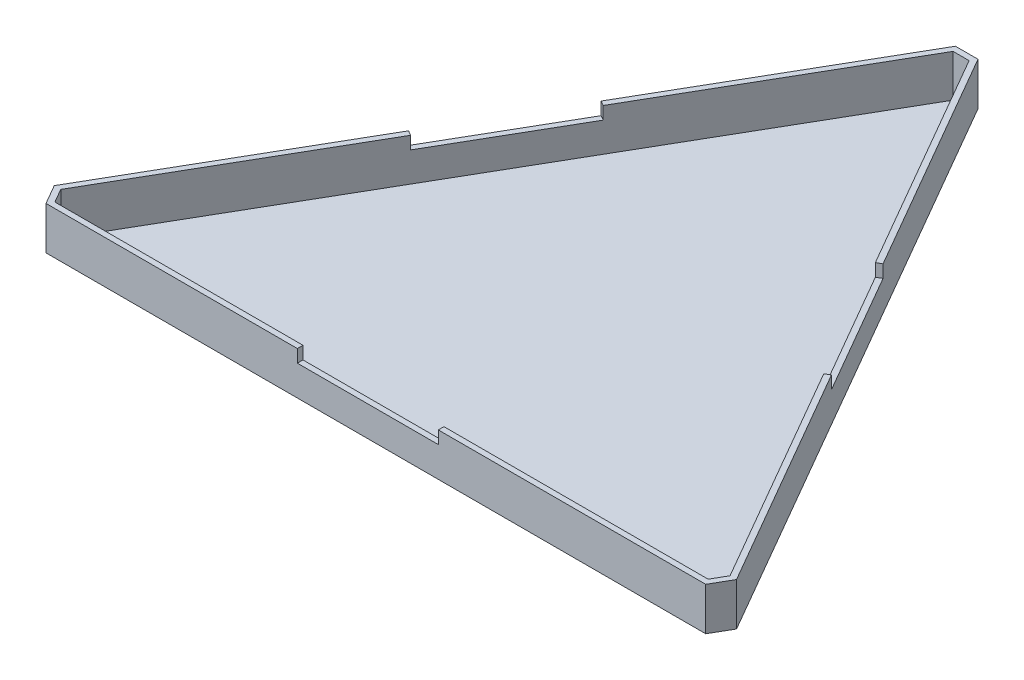
ISO-10303-21;
HEADER;
FILE_DESCRIPTION(('STEP AP214'),'2;1');
FILE_NAME('part.step','',(''),(''),'','','');
FILE_SCHEMA(('AUTOMOTIVE_DESIGN { 1 0 10303 214 1 1 1 1 }'));
ENDSEC;
DATA;
#1=APPLICATION_CONTEXT('core data for automotive mechanical design processes');
#2=APPLICATION_PROTOCOL_DEFINITION('international standard','automotive_design',2000,#1);
#3=PRODUCT_CONTEXT('',#1,'mechanical');
#4=PRODUCT('Part','Part','',(#3));
#5=PRODUCT_RELATED_PRODUCT_CATEGORY('part','',(#4));
#6=PRODUCT_DEFINITION_FORMATION('','',#4);
#7=PRODUCT_DEFINITION_CONTEXT('part definition',#1,'design');
#8=PRODUCT_DEFINITION('design','',#6,#7);
#9=PRODUCT_DEFINITION_SHAPE('','',#8);
#10=(LENGTH_UNIT() NAMED_UNIT(*) SI_UNIT(.MILLI.,.METRE.));
#11=(NAMED_UNIT(*) PLANE_ANGLE_UNIT() SI_UNIT($,.RADIAN.));
#12=(NAMED_UNIT(*) SI_UNIT($,.STERADIAN.) SOLID_ANGLE_UNIT());
#13=UNCERTAINTY_MEASURE_WITH_UNIT(LENGTH_MEASURE(1.E-05),#10,'distance_accuracy_value','');
#14=(GEOMETRIC_REPRESENTATION_CONTEXT(3) GLOBAL_UNCERTAINTY_ASSIGNED_CONTEXT((#13)) GLOBAL_UNIT_ASSIGNED_CONTEXT((#10,
#11,#12)) REPRESENTATION_CONTEXT('',''));
#15=CARTESIAN_POINT('',(0.,0.,0.));
#16=DIRECTION('',(0.,0.,1.));
#17=DIRECTION('',(1.,0.,0.));
#18=AXIS2_PLACEMENT_3D('',#15,#16,#17);
#19=CARTESIAN_POINT('',(0.,15.2,0.));
#20=DIRECTION('',(0.,-1.,0.));
#21=DIRECTION('',(0.,0.,-1.));
#22=AXIS2_PLACEMENT_3D('',#19,#20,#21);
#23=PLANE('',#22);
#24=DIRECTION('',(-0.500000615432714,0.,0.866025048463904));
#25=VECTOR('',#24,1.);
#26=CARTESIAN_POINT('',(228.582007950323,15.2,134.984248571585));
#27=LINE('',#26,#25);
#28=CARTESIAN_POINT('',(274.004699141402,15.2,56.3099687288063));
#29=VERTEX_POINT('',#28);
#30=CARTESIAN_POINT('',(228.582007950323,15.2,134.984248571585));
#31=VERTEX_POINT('',#30);
#32=EDGE_CURVE('E268',#29,#31,#27,.T.);
#33=ORIENTED_EDGE('',*,*,#32,.F.);
#34=DIRECTION('',(-0.866025052847215,0.,-0.500000607840609));
#35=VECTOR('',#34,1.);
#36=CARTESIAN_POINT('',(44.1183898726802,15.2,-76.4151689455581));
#37=LINE('',#36,#35);
#38=CARTESIAN_POINT('',(272.272705051594,15.2,55.3099998539647));
#39=VERTEX_POINT('',#38);
#40=EDGE_CURVE('E219',#29,#39,#37,.T.);
#41=ORIENTED_EDGE('',*,*,#40,.T.);
#42=DIRECTION('',(-0.500000607840609,0.,0.866025052847215));
#43=VECTOR('',#42,1.);
#44=CARTESIAN_POINT('',(226.272682948801,15.2,134.984246140569));
#45=LINE('',#44,#43);
#46=CARTESIAN_POINT('',(226.272682948801,15.2,134.984246140569));
#47=VERTEX_POINT('',#46);
#48=EDGE_CURVE('E303',#39,#47,#45,.T.);
#49=ORIENTED_EDGE('',*,*,#48,.T.);
#50=DIRECTION('',(0.50006108259511,0.,0.865990134859403));
#51=VECTOR('',#50,1.);
#52=CARTESIAN_POINT('',(230.273290915147,15.2,141.912373829124));
#53=LINE('',#52,#51);
#54=CARTESIAN_POINT('',(230.273290915147,15.2,141.912373829124));
#55=VERTEX_POINT('',#54);
#56=EDGE_CURVE('E306',#47,#55,#53,.T.);
#57=ORIENTED_EDGE('',*,*,#56,.T.);
#58=DIRECTION('',(1.,0.,0.));
#59=VECTOR('',#58,1.);
#60=CARTESIAN_POINT('',(230.273290915147,15.2,141.912373829124));
#61=LINE('',#60,#59);
#62=CARTESIAN_POINT('',(319.427420985759,15.2,141.912373829124));
#63=VERTEX_POINT('',#62);
#64=EDGE_CURVE('E290',#55,#63,#61,.T.);
#65=ORIENTED_EDGE('',*,*,#64,.T.);
#66=DIRECTION('',(0.,0.,-1.));
#67=VECTOR('',#66,1.);
#68=CARTESIAN_POINT('',(319.427420985759,15.2,0.));
#69=LINE('',#68,#67);
#70=CARTESIAN_POINT('',(319.427420985759,15.2,139.912397611069));
#71=VERTEX_POINT('',#70);
#72=EDGE_CURVE('E348',#63,#71,#69,.T.);
#73=ORIENTED_EDGE('',*,*,#72,.T.);
#74=DIRECTION('',(0.999999999999963,0.,2.70255197421388E-07));
#75=VECTOR('',#74,1.);
#76=CARTESIAN_POINT('',(231.427991453041,15.2,139.912373828765));
#77=LINE('',#76,#75);
#78=CARTESIAN_POINT('',(231.427991453041,15.2,139.912373828765));
#79=VERTEX_POINT('',#78);
#80=EDGE_CURVE('E256',#79,#71,#77,.T.);
#81=ORIENTED_EDGE('',*,*,#80,.F.);
#82=DIRECTION('',(0.50009607956599,0.,0.865969925114451));
#83=VECTOR('',#82,1.);
#84=CARTESIAN_POINT('',(231.427991453041,15.2,139.912373828765));
#85=LINE('',#84,#83);
#86=EDGE_CURVE('E253',#31,#79,#85,.T.);
#87=ORIENTED_EDGE('',*,*,#86,.F.);
#88=EDGE_LOOP('',(#33,#41,#49,#57,#65,#73,#81,#87));
#89=FACE_BOUND('',#88,.T.);
#90=ADVANCED_FACE('F33',(#89),#23,.F.);
#91=CARTESIAN_POINT('',(343.272757546418,15.2,-67.6654990750007));
#92=VERTEX_POINT('',#91);
#93=CARTESIAN_POINT('',(297.272735443625,15.2,12.0087472116039));
#94=VERTEX_POINT('',#93);
#95=EDGE_CURVE('E304',#92,#94,#45,.T.);
#96=ORIENTED_EDGE('',*,*,#95,.T.);
#97=DIRECTION('',(0.866025052847215,0.,0.500000607840609));
#98=VECTOR('',#97,1.);
#99=CARTESIAN_POINT('',(69.1184202647106,15.2,-119.716421587919));
#100=LINE('',#99,#98);
#101=CARTESIAN_POINT('',(299.004729913038,15.2,13.008716305611));
#102=VERTEX_POINT('',#101);
#103=EDGE_CURVE('E206',#94,#102,#100,.T.);
#104=ORIENTED_EDGE('',*,*,#103,.T.);
#105=CARTESIAN_POINT('',(344.427420985759,15.2,-65.665563332167));
#106=VERTEX_POINT('',#105);
#107=EDGE_CURVE('E269',#106,#102,#27,.T.);
#108=ORIENTED_EDGE('',*,*,#107,.F.);
#109=DIRECTION('',(-1.,0.,0.));
#110=VECTOR('',#109,1.);
#111=CARTESIAN_POINT('',(344.427420985759,15.2,-65.665563332167));
#112=LINE('',#111,#110);
#113=CARTESIAN_POINT('',(350.118252434361,15.2,-65.665563332167));
#114=VERTEX_POINT('',#113);
#115=EDGE_CURVE('E265',#114,#106,#112,.T.);
#116=ORIENTED_EDGE('',*,*,#115,.F.);
#117=DIRECTION('',(-0.5,0.,-0.866025403784439));
#118=VECTOR('',#117,1.);
#119=CARTESIAN_POINT('',(350.118252434361,15.2,-65.665563332167));
#120=LINE('',#119,#118);
#121=CARTESIAN_POINT('',(395.540962351682,15.2,13.0088780620962));
#122=VERTEX_POINT('',#121);
#123=EDGE_CURVE('E261',#122,#114,#120,.T.);
#124=ORIENTED_EDGE('',*,*,#123,.F.);
#125=DIRECTION('',(0.866025403784439,0.,-0.5));
#126=VECTOR('',#125,1.);
#127=CARTESIAN_POINT('',(104.518250026175,15.2,181.030919363523));
#128=LINE('',#127,#126);
#129=CARTESIAN_POINT('',(397.272958932514,15.2,12.0089093699171));
#130=VERTEX_POINT('',#129);
#131=EDGE_CURVE('E367',#122,#130,#128,.T.);
#132=ORIENTED_EDGE('',*,*,#131,.T.);
#133=DIRECTION('',(-0.5,0.,-0.866025403784439));
#134=VECTOR('',#133,1.);
#135=CARTESIAN_POINT('',(351.272917769317,15.2,-67.6654990750007));
#136=LINE('',#135,#134);
#137=CARTESIAN_POINT('',(351.272917769317,15.2,-67.6654990750007));
#138=VERTEX_POINT('',#137);
#139=EDGE_CURVE('E296',#130,#138,#136,.T.);
#140=ORIENTED_EDGE('',*,*,#139,.T.);
#141=DIRECTION('',(-1.,0.,0.));
#142=VECTOR('',#141,1.);
#143=CARTESIAN_POINT('',(343.272757546418,15.2,-67.6654990750007));
#144=LINE('',#143,#142);
#145=EDGE_CURVE('E300',#138,#92,#144,.T.);
#146=ORIENTED_EDGE('',*,*,#145,.T.);
#147=EDGE_LOOP('',(#96,#104,#108,#116,#124,#132,#140,#146));
#148=FACE_BOUND('',#147,.T.);
#149=ADVANCED_FACE('F376',(#148),#23,.F.);
#150=CARTESIAN_POINT('',(343.272757546418,0.2,-67.6654990750007));
#151=DIRECTION('',(0.,0.,-1.));
#152=DIRECTION('',(-1.,0.,0.));
#153=AXIS2_PLACEMENT_3D('',#150,#151,#152);
#154=PLANE('',#153);
#155=DIRECTION('',(1.,0.,0.));
#156=VECTOR('',#155,1.);
#157=CARTESIAN_POINT('',(343.272757546418,0.,-67.6654990750007));
#158=LINE('',#157,#156);
#159=CARTESIAN_POINT('',(343.272757546418,0.,-67.6654990750007));
#160=VERTEX_POINT('',#159);
#161=CARTESIAN_POINT('',(351.272917769317,0.,-67.6654990750007));
#162=VERTEX_POINT('',#161);
#163=EDGE_CURVE('E327',#160,#162,#158,.T.);
#164=ORIENTED_EDGE('',*,*,#163,.F.);
#165=DIRECTION('',(0.,-1.,0.));
#166=VECTOR('',#165,1.);
#167=CARTESIAN_POINT('',(343.272757546418,0.2,-67.6654990750007));
#168=LINE('',#167,#166);
#169=EDGE_CURVE('E346',#92,#160,#168,.T.);
#170=ORIENTED_EDGE('',*,*,#169,.F.);
#171=ORIENTED_EDGE('',*,*,#145,.F.);
#172=DIRECTION('',(0.,-1.,0.));
#173=VECTOR('',#172,1.);
#174=CARTESIAN_POINT('',(351.272917769317,0.2,-67.6654990750007));
#175=LINE('',#174,#173);
#176=EDGE_CURVE('E345',#138,#162,#175,.T.);
#177=ORIENTED_EDGE('',*,*,#176,.T.);
#178=EDGE_LOOP('',(#164,#170,#171,#177));
#179=FACE_BOUND('',#178,.T.);
#180=ADVANCED_FACE('F35',(#179),#154,.T.);
#181=CARTESIAN_POINT('',(226.272682948801,0.2,134.984246140569));
#182=DIRECTION('',(-0.866025052847215,0.,-0.500000607840609));
#183=DIRECTION('',(-0.500000607840609,0.,0.866025052847215));
#184=AXIS2_PLACEMENT_3D('',#181,#182,#183);
#185=PLANE('',#184);
#186=DIRECTION('',(0.,1.,0.));
#187=VECTOR('',#186,1.);
#188=CARTESIAN_POINT('',(272.272705051594,19.7,55.3099998539647));
#189=LINE('',#188,#187);
#190=CARTESIAN_POINT('',(272.272705051594,10.7,55.3099998539647));
#191=VERTEX_POINT('',#190);
#192=EDGE_CURVE('E210',#191,#39,#189,.T.);
#193=ORIENTED_EDGE('',*,*,#192,.F.);
#194=DIRECTION('',(-0.500000607840609,0.,0.866025052847215));
#195=VECTOR('',#194,1.);
#196=CARTESIAN_POINT('',(297.272735443625,10.7,12.0087472116039));
#197=LINE('',#196,#195);
#198=CARTESIAN_POINT('',(297.272735443625,10.7,12.0087472116039));
#199=VERTEX_POINT('',#198);
#200=EDGE_CURVE('E196',#199,#191,#197,.T.);
#201=ORIENTED_EDGE('',*,*,#200,.F.);
#202=DIRECTION('',(0.,-1.,0.));
#203=VECTOR('',#202,1.);
#204=CARTESIAN_POINT('',(297.272735443625,19.7,12.0087472116039));
#205=LINE('',#204,#203);
#206=EDGE_CURVE('E203',#94,#199,#205,.T.);
#207=ORIENTED_EDGE('',*,*,#206,.F.);
#208=ORIENTED_EDGE('',*,*,#95,.F.);
#209=ORIENTED_EDGE('',*,*,#169,.T.);
#210=DIRECTION('',(0.500000607840609,0.,-0.866025052847215));
#211=VECTOR('',#210,1.);
#212=CARTESIAN_POINT('',(226.272682948801,0.,134.984246140569));
#213=LINE('',#212,#211);
#214=CARTESIAN_POINT('',(226.272682948801,0.,134.984246140569));
#215=VERTEX_POINT('',#214);
#216=EDGE_CURVE('E342',#215,#160,#213,.T.);
#217=ORIENTED_EDGE('',*,*,#216,.F.);
#218=DIRECTION('',(0.,-1.,0.));
#219=VECTOR('',#218,1.);
#220=CARTESIAN_POINT('',(226.272682948801,0.2,134.984246140569));
#221=LINE('',#220,#219);
#222=EDGE_CURVE('E349',#47,#215,#221,.T.);
#223=ORIENTED_EDGE('',*,*,#222,.F.);
#224=ORIENTED_EDGE('',*,*,#48,.F.);
#225=EDGE_LOOP('',(#193,#201,#207,#208,#209,#217,#223,#224));
#226=FACE_BOUND('',#225,.T.);
#227=ADVANCED_FACE('F212',(#226),#185,.T.);
#228=CARTESIAN_POINT('',(230.273290915147,0.2,141.912373829124));
#229=DIRECTION('',(-0.865990134859403,0.,0.50006108259511));
#230=DIRECTION('',(0.50006108259511,0.,0.865990134859403));
#231=AXIS2_PLACEMENT_3D('',#228,#229,#230);
#232=PLANE('',#231);
#233=DIRECTION('',(-0.50006108259511,0.,-0.865990134859403));
#234=VECTOR('',#233,1.);
#235=CARTESIAN_POINT('',(230.273290915147,0.,141.912373829124));
#236=LINE('',#235,#234);
#237=CARTESIAN_POINT('',(230.273290915147,0.,141.912373829124));
#238=VERTEX_POINT('',#237);
#239=EDGE_CURVE('E339',#238,#215,#236,.T.);
#240=ORIENTED_EDGE('',*,*,#239,.F.);
#241=DIRECTION('',(0.,-1.,0.));
#242=VECTOR('',#241,1.);
#243=CARTESIAN_POINT('',(230.273290915147,0.2,141.912373829124));
#244=LINE('',#243,#242);
#245=EDGE_CURVE('E351',#55,#238,#244,.T.);
#246=ORIENTED_EDGE('',*,*,#245,.F.);
#247=ORIENTED_EDGE('',*,*,#56,.F.);
#248=ORIENTED_EDGE('',*,*,#222,.T.);
#249=EDGE_LOOP('',(#240,#246,#247,#248));
#250=FACE_BOUND('',#249,.T.);
#251=ADVANCED_FACE('F411',(#250),#232,.T.);
#252=CARTESIAN_POINT('',(230.273290915147,0.2,141.912373829124));
#253=DIRECTION('',(0.,0.,-1.));
#254=DIRECTION('',(-1.,0.,0.));
#255=AXIS2_PLACEMENT_3D('',#252,#253,#254);
#256=PLANE('',#255);
#257=CARTESIAN_POINT('',(369.427420985759,15.2,141.912373829124));
#258=VERTEX_POINT('',#257);
#259=CARTESIAN_POINT('',(464.273241085033,15.2,141.912373829124));
#260=VERTEX_POINT('',#259);
#261=EDGE_CURVE('E289',#258,#260,#61,.T.);
#262=ORIENTED_EDGE('',*,*,#261,.F.);
#263=DIRECTION('',(0.,1.,0.));
#264=VECTOR('',#263,1.);
#265=CARTESIAN_POINT('',(369.427420985759,19.7,141.912373829124));
#266=LINE('',#265,#264);
#267=CARTESIAN_POINT('',(369.427420985759,10.7,141.912373829124));
#268=VERTEX_POINT('',#267);
#269=EDGE_CURVE('E237',#268,#258,#266,.T.);
#270=ORIENTED_EDGE('',*,*,#269,.F.);
#271=DIRECTION('',(1.,0.,0.));
#272=VECTOR('',#271,1.);
#273=CARTESIAN_POINT('',(319.427420985759,10.7,141.912373829124));
#274=LINE('',#273,#272);
#275=CARTESIAN_POINT('',(319.427420985759,10.7,141.912373829124));
#276=VERTEX_POINT('',#275);
#277=EDGE_CURVE('E242',#276,#268,#274,.T.);
#278=ORIENTED_EDGE('',*,*,#277,.F.);
#279=DIRECTION('',(0.,-1.,0.));
#280=VECTOR('',#279,1.);
#281=CARTESIAN_POINT('',(319.427420985759,19.7,141.912373829124));
#282=LINE('',#281,#280);
#283=EDGE_CURVE('E239',#63,#276,#282,.T.);
#284=ORIENTED_EDGE('',*,*,#283,.F.);
#285=ORIENTED_EDGE('',*,*,#64,.F.);
#286=ORIENTED_EDGE('',*,*,#245,.T.);
#287=DIRECTION('',(1.,0.,0.));
#288=VECTOR('',#287,1.);
#289=CARTESIAN_POINT('',(230.273290915147,0.,141.912373829124));
#290=LINE('',#289,#288);
#291=CARTESIAN_POINT('',(464.273241085033,0.,141.912373829124));
#292=VERTEX_POINT('',#291);
#293=EDGE_CURVE('E336',#238,#292,#290,.T.);
#294=ORIENTED_EDGE('',*,*,#293,.T.);
#295=DIRECTION('',(0.,-1.,0.));
#296=VECTOR('',#295,1.);
#297=CARTESIAN_POINT('',(464.273241085033,0.2,141.912373829124));
#298=LINE('',#297,#296);
#299=EDGE_CURVE('E353',#260,#292,#298,.T.);
#300=ORIENTED_EDGE('',*,*,#299,.F.);
#301=EDGE_LOOP('',(#262,#270,#278,#284,#285,#286,#294,#300));
#302=FACE_BOUND('',#301,.T.);
#303=ADVANCED_FACE('F450',(#302),#256,.F.);
#304=CARTESIAN_POINT('',(468.273000095712,0.2,134.984588004057));
#305=DIRECTION('',(0.866025403801281,0.,0.499999999970827));
#306=DIRECTION('',(0.499999999970827,0.,-0.866025403801282));
#307=AXIS2_PLACEMENT_3D('',#304,#305,#306);
#308=PLANE('',#307);
#309=DIRECTION('',(-0.499999999970827,0.,0.866025403801281));
#310=VECTOR('',#309,1.);
#311=CARTESIAN_POINT('',(468.273000095712,0.,134.984588004057));
#312=LINE('',#311,#310);
#313=CARTESIAN_POINT('',(468.273000095712,0.,134.984588004057));
#314=VERTEX_POINT('',#313);
#315=EDGE_CURVE('E333',#314,#292,#312,.T.);
#316=ORIENTED_EDGE('',*,*,#315,.F.);
#317=DIRECTION('',(0.,-1.,0.));
#318=VECTOR('',#317,1.);
#319=CARTESIAN_POINT('',(468.273000095712,0.2,134.984588004057));
#320=LINE('',#319,#318);
#321=CARTESIAN_POINT('',(468.273000095712,15.2,134.984588004057));
#322=VERTEX_POINT('',#321);
#323=EDGE_CURVE('E355',#322,#314,#320,.T.);
#324=ORIENTED_EDGE('',*,*,#323,.F.);
#325=DIRECTION('',(0.499999999970827,0.,-0.866025403801281));
#326=VECTOR('',#325,1.);
#327=CARTESIAN_POINT('',(468.273000095712,15.2,134.984588004057));
#328=LINE('',#327,#326);
#329=EDGE_CURVE('E293',#260,#322,#328,.T.);
#330=ORIENTED_EDGE('',*,*,#329,.F.);
#331=ORIENTED_EDGE('',*,*,#299,.T.);
#332=EDGE_LOOP('',(#316,#324,#330,#331));
#333=FACE_BOUND('',#332,.T.);
#334=ADVANCED_FACE('F446',(#333),#308,.T.);
#335=CARTESIAN_POINT('',(351.272917769317,0.2,-67.6654990750007));
#336=DIRECTION('',(0.866025403784439,0.,-0.5));
#337=DIRECTION('',(-0.5,0.,-0.866025403784439));
#338=AXIS2_PLACEMENT_3D('',#335,#336,#337);
#339=PLANE('',#338);
#340=DIRECTION('',(0.,1.,0.));
#341=VECTOR('',#340,1.);
#342=CARTESIAN_POINT('',(397.272958932514,19.7,12.0089093699171));
#343=LINE('',#342,#341);
#344=CARTESIAN_POINT('',(397.272958932514,10.7,12.0089093699171));
#345=VERTEX_POINT('',#344);
#346=EDGE_CURVE('E222',#345,#130,#343,.T.);
#347=ORIENTED_EDGE('',*,*,#346,.F.);
#348=DIRECTION('',(-0.500000000000001,0.,-0.866025403784438));
#349=VECTOR('',#348,1.);
#350=CARTESIAN_POINT('',(422.272958932514,10.7,55.310179559139));
#351=LINE('',#350,#349);
#352=CARTESIAN_POINT('',(422.272958932514,10.7,55.310179559139));
#353=VERTEX_POINT('',#352);
#354=EDGE_CURVE('E227',#353,#345,#351,.T.);
#355=ORIENTED_EDGE('',*,*,#354,.F.);
#356=DIRECTION('',(0.,-1.,0.));
#357=VECTOR('',#356,1.);
#358=CARTESIAN_POINT('',(422.272958932514,19.7,55.310179559139));
#359=LINE('',#358,#357);
#360=CARTESIAN_POINT('',(422.272958932514,15.2,55.310179559139));
#361=VERTEX_POINT('',#360);
#362=EDGE_CURVE('E224',#361,#353,#359,.T.);
#363=ORIENTED_EDGE('',*,*,#362,.F.);
#364=EDGE_CURVE('E297',#322,#361,#136,.T.);
#365=ORIENTED_EDGE('',*,*,#364,.F.);
#366=ORIENTED_EDGE('',*,*,#323,.T.);
#367=DIRECTION('',(0.5,0.,0.866025403784439));
#368=VECTOR('',#367,1.);
#369=CARTESIAN_POINT('',(351.272917769317,0.,-67.6654990750007));
#370=LINE('',#369,#368);
#371=EDGE_CURVE('E330',#162,#314,#370,.T.);
#372=ORIENTED_EDGE('',*,*,#371,.F.);
#373=ORIENTED_EDGE('',*,*,#176,.F.);
#374=ORIENTED_EDGE('',*,*,#139,.F.);
#375=EDGE_LOOP('',(#347,#355,#363,#365,#366,#372,#373,#374));
#376=FACE_BOUND('',#375,.T.);
#377=ADVANCED_FACE('F398',(#376),#339,.T.);
#378=CARTESIAN_POINT('',(0.,0.,0.));
#379=DIRECTION('',(0.,-1.,0.));
#380=DIRECTION('',(0.,0.,-1.));
#381=AXIS2_PLACEMENT_3D('',#378,#379,#380);
#382=PLANE('',#381);
#383=ORIENTED_EDGE('',*,*,#163,.T.);
#384=ORIENTED_EDGE('',*,*,#371,.T.);
#385=ORIENTED_EDGE('',*,*,#315,.T.);
#386=ORIENTED_EDGE('',*,*,#293,.F.);
#387=ORIENTED_EDGE('',*,*,#239,.T.);
#388=ORIENTED_EDGE('',*,*,#216,.T.);
#389=EDGE_LOOP('',(#383,#384,#385,#386,#387,#388));
#390=FACE_BOUND('',#389,.T.);
#391=ADVANCED_FACE('F407',(#390),#382,.T.);
#392=CARTESIAN_POINT('',(231.427991453041,15.2,139.912373828765));
#393=DIRECTION('',(0.865969925114451,0.,-0.50009607956599));
#394=DIRECTION('',(-0.50009607956599,0.,-0.865969925114451));
#395=AXIS2_PLACEMENT_3D('',#392,#393,#394);
#396=PLANE('',#395);
#397=DIRECTION('',(0.50009607956599,0.,0.865969925114451));
#398=VECTOR('',#397,1.);
#399=CARTESIAN_POINT('',(112.957161017521,0.2,-65.2325580201885));
#400=LINE('',#399,#398);
#401=CARTESIAN_POINT('',(228.582007950323,0.2,134.984248571585));
#402=VERTEX_POINT('',#401);
#403=CARTESIAN_POINT('',(231.427991453041,0.200000000000004,139.912373828765));
#404=VERTEX_POINT('',#403);
#405=EDGE_CURVE('E324',#402,#404,#400,.T.);
#406=ORIENTED_EDGE('',*,*,#405,.F.);
#407=DIRECTION('',(0.,-1.,0.));
#408=VECTOR('',#407,1.);
#409=CARTESIAN_POINT('',(228.582007950323,15.2,134.984248571585));
#410=LINE('',#409,#408);
#411=EDGE_CURVE('E272',#31,#402,#410,.T.);
#412=ORIENTED_EDGE('',*,*,#411,.F.);
#413=ORIENTED_EDGE('',*,*,#86,.T.);
#414=DIRECTION('',(0.,-1.,0.));
#415=VECTOR('',#414,1.);
#416=CARTESIAN_POINT('',(231.427991453041,15.2,139.912373828765));
#417=LINE('',#416,#415);
#418=EDGE_CURVE('E286',#79,#404,#417,.T.);
#419=ORIENTED_EDGE('',*,*,#418,.T.);
#420=EDGE_LOOP('',(#406,#412,#413,#419));
#421=FACE_BOUND('',#420,.T.);
#422=ADVANCED_FACE('F422',(#421),#396,.T.);
#423=CARTESIAN_POINT('',(231.427991453041,15.2,139.912373828765));
#424=DIRECTION('',(2.70255197421388E-07,0.,-0.999999999999963));
#425=DIRECTION('',(-0.999999999999964,0.,-2.70255197421388E-07));
#426=AXIS2_PLACEMENT_3D('',#423,#424,#425);
#427=PLANE('',#426);
#428=DIRECTION('',(0.,-1.,0.));
#429=VECTOR('',#428,1.);
#430=CARTESIAN_POINT('',(369.427420985759,15.2,139.912411123828));
#431=LINE('',#430,#429);
#432=CARTESIAN_POINT('',(369.427420985759,15.2,139.912411123828));
#433=VERTEX_POINT('',#432);
#434=CARTESIAN_POINT('',(369.427420985759,10.7,139.912411123828));
#435=VERTEX_POINT('',#434);
#436=EDGE_CURVE('E251',#433,#435,#431,.T.);
#437=ORIENTED_EDGE('',*,*,#436,.F.);
#438=CARTESIAN_POINT('',(463.118576697739,15.2,139.91243644435));
#439=VERTEX_POINT('',#438);
#440=EDGE_CURVE('E255',#433,#439,#77,.T.);
#441=ORIENTED_EDGE('',*,*,#440,.T.);
#442=DIRECTION('',(0.,-1.,0.));
#443=VECTOR('',#442,1.);
#444=CARTESIAN_POINT('',(463.118576697739,15.2,139.91243644435));
#445=LINE('',#444,#443);
#446=CARTESIAN_POINT('',(463.118576697739,0.200000000000004,139.91243644435));
#447=VERTEX_POINT('',#446);
#448=EDGE_CURVE('E283',#439,#447,#445,.T.);
#449=ORIENTED_EDGE('',*,*,#448,.T.);
#450=DIRECTION('',(0.999999999999964,0.,2.70255197421388E-07));
#451=VECTOR('',#450,1.);
#452=CARTESIAN_POINT('',(-3.78120293077787E-05,0.2,139.912311284138));
#453=LINE('',#452,#451);
#454=EDGE_CURVE('E321',#404,#447,#453,.T.);
#455=ORIENTED_EDGE('',*,*,#454,.F.);
#456=ORIENTED_EDGE('',*,*,#418,.F.);
#457=ORIENTED_EDGE('',*,*,#80,.T.);
#458=DIRECTION('',(0.,1.,0.));
#459=VECTOR('',#458,1.);
#460=CARTESIAN_POINT('',(319.427420985759,15.2,139.912397611069));
#461=LINE('',#460,#459);
#462=CARTESIAN_POINT('',(319.427420985759,10.7,139.912397611069));
#463=VERTEX_POINT('',#462);
#464=EDGE_CURVE('E248',#463,#71,#461,.T.);
#465=ORIENTED_EDGE('',*,*,#464,.F.);
#466=DIRECTION('',(-0.999999999999964,0.,-2.70255197421388E-07));
#467=VECTOR('',#466,1.);
#468=CARTESIAN_POINT('',(231.427991453041,10.7,139.912373828765));
#469=LINE('',#468,#467);
#470=EDGE_CURVE('E363',#435,#463,#469,.T.);
#471=ORIENTED_EDGE('',*,*,#470,.F.);
#472=EDGE_LOOP('',(#437,#441,#449,#455,#456,#457,#465,#471));
#473=FACE_BOUND('',#472,.T.);
#474=ADVANCED_FACE('F428',(#473),#427,.T.);
#475=CARTESIAN_POINT('',(465.963671321269,15.2,134.984588004057));
#476=DIRECTION('',(-0.866025403784441,0.,-0.499999999999997));
#477=DIRECTION('',(-0.499999999999997,0.,0.866025403784441));
#478=AXIS2_PLACEMENT_3D('',#475,#476,#477);
#479=PLANE('',#478);
#480=DIRECTION('',(0.499999999999997,0.,-0.866025403784441));
#481=VECTOR('',#480,1.);
#482=CARTESIAN_POINT('',(407.922794656397,0.2,235.514335303453));
#483=LINE('',#482,#481);
#484=CARTESIAN_POINT('',(465.963671321269,0.200000000000004,134.984588004057));
#485=VERTEX_POINT('',#484);
#486=EDGE_CURVE('E318',#447,#485,#483,.T.);
#487=ORIENTED_EDGE('',*,*,#486,.F.);
#488=ORIENTED_EDGE('',*,*,#448,.F.);
#489=DIRECTION('',(0.499999999999997,0.,-0.866025403784441));
#490=VECTOR('',#489,1.);
#491=CARTESIAN_POINT('',(465.963671321269,15.2,134.984588004057));
#492=LINE('',#491,#490);
#493=CARTESIAN_POINT('',(465.963671321269,15.2,134.984588004057));
#494=VERTEX_POINT('',#493);
#495=EDGE_CURVE('E259',#439,#494,#492,.T.);
#496=ORIENTED_EDGE('',*,*,#495,.T.);
#497=DIRECTION('',(0.,-1.,0.));
#498=VECTOR('',#497,1.);
#499=CARTESIAN_POINT('',(465.963671321269,15.2,134.984588004057));
#500=LINE('',#499,#498);
#501=EDGE_CURVE('E280',#494,#485,#500,.T.);
#502=ORIENTED_EDGE('',*,*,#501,.T.);
#503=EDGE_LOOP('',(#487,#488,#496,#502));
#504=FACE_BOUND('',#503,.T.);
#505=ADVANCED_FACE('F435',(#504),#479,.T.);
#506=CARTESIAN_POINT('',(350.118252434361,15.2,-65.665563332167));
#507=DIRECTION('',(-0.866025403784438,0.,0.5));
#508=DIRECTION('',(0.5,0.,0.866025403784439));
#509=AXIS2_PLACEMENT_3D('',#506,#507,#508);
#510=PLANE('',#509);
#511=DIRECTION('',(0.,-1.,0.));
#512=VECTOR('',#511,1.);
#513=CARTESIAN_POINT('',(395.540962351682,15.2,13.0088780620962));
#514=LINE('',#513,#512);
#515=CARTESIAN_POINT('',(395.540962351682,10.7,13.0088780620962));
#516=VERTEX_POINT('',#515);
#517=EDGE_CURVE('E235',#122,#516,#514,.T.);
#518=ORIENTED_EDGE('',*,*,#517,.F.);
#519=ORIENTED_EDGE('',*,*,#123,.T.);
#520=DIRECTION('',(0.,-1.,0.));
#521=VECTOR('',#520,1.);
#522=CARTESIAN_POINT('',(350.118252434361,15.2,-65.665563332167));
#523=LINE('',#522,#521);
#524=CARTESIAN_POINT('',(350.118252434361,0.200000000000004,-65.665563332167));
#525=VERTEX_POINT('',#524);
#526=EDGE_CURVE('E277',#114,#525,#523,.T.);
#527=ORIENTED_EDGE('',*,*,#526,.T.);
#528=DIRECTION('',(-0.5,0.,-0.866025403784439));
#529=VECTOR('',#528,1.);
#530=CARTESIAN_POINT('',(291.022712325507,0.2,-168.022041301426));
#531=LINE('',#530,#529);
#532=EDGE_CURVE('E315',#485,#525,#531,.T.);
#533=ORIENTED_EDGE('',*,*,#532,.F.);
#534=ORIENTED_EDGE('',*,*,#501,.F.);
#535=CARTESIAN_POINT('',(420.540962351682,15.2,56.3101482513181));
#536=VERTEX_POINT('',#535);
#537=EDGE_CURVE('E262',#494,#536,#120,.T.);
#538=ORIENTED_EDGE('',*,*,#537,.T.);
#539=DIRECTION('',(0.,1.,0.));
#540=VECTOR('',#539,1.);
#541=CARTESIAN_POINT('',(420.540962351682,15.2,56.3101482513181));
#542=LINE('',#541,#540);
#543=CARTESIAN_POINT('',(420.540962351682,10.7,56.3101482513181));
#544=VERTEX_POINT('',#543);
#545=EDGE_CURVE('E56',#544,#536,#542,.T.);
#546=ORIENTED_EDGE('',*,*,#545,.F.);
#547=DIRECTION('',(0.5,0.,0.866025403784439));
#548=VECTOR('',#547,1.);
#549=CARTESIAN_POINT('',(350.118252434361,10.7,-65.665563332167));
#550=LINE('',#549,#548);
#551=EDGE_CURVE('E370',#516,#544,#550,.T.);
#552=ORIENTED_EDGE('',*,*,#551,.F.);
#553=EDGE_LOOP('',(#518,#519,#527,#533,#534,#538,#546,#552));
#554=FACE_BOUND('',#553,.T.);
#555=ADVANCED_FACE('F387',(#554),#510,.T.);
#556=CARTESIAN_POINT('',(344.427420985759,15.2,-65.665563332167));
#557=DIRECTION('',(0.,0.,1.));
#558=DIRECTION('',(1.,0.,0.));
#559=AXIS2_PLACEMENT_3D('',#556,#557,#558);
#560=PLANE('',#559);
#561=DIRECTION('',(-1.,0.,0.));
#562=VECTOR('',#561,1.);
#563=CARTESIAN_POINT('',(1.6013349937264E-13,0.2,-65.6655633321679));
#564=LINE('',#563,#562);
#565=CARTESIAN_POINT('',(344.427420985759,0.200000000000004,-65.665563332167));
#566=VERTEX_POINT('',#565);
#567=EDGE_CURVE('E312',#525,#566,#564,.T.);
#568=ORIENTED_EDGE('',*,*,#567,.F.);
#569=ORIENTED_EDGE('',*,*,#526,.F.);
#570=ORIENTED_EDGE('',*,*,#115,.T.);
#571=DIRECTION('',(0.,-1.,0.));
#572=VECTOR('',#571,1.);
#573=CARTESIAN_POINT('',(344.427420985759,15.2,-65.665563332167));
#574=LINE('',#573,#572);
#575=EDGE_CURVE('E274',#106,#566,#574,.T.);
#576=ORIENTED_EDGE('',*,*,#575,.T.);
#577=EDGE_LOOP('',(#568,#569,#570,#576));
#578=FACE_BOUND('',#577,.T.);
#579=ADVANCED_FACE('F382',(#578),#560,.T.);
#580=CARTESIAN_POINT('',(228.582007950323,15.2,134.984248571585));
#581=DIRECTION('',(0.866025048463904,0.,0.500000615432714));
#582=DIRECTION('',(0.500000615432714,0.,-0.866025048463904));
#583=AXIS2_PLACEMENT_3D('',#580,#581,#582);
#584=PLANE('',#583);
#585=DIRECTION('',(0.,-1.,0.));
#586=VECTOR('',#585,1.);
#587=CARTESIAN_POINT('',(274.004699141402,15.2,56.3099687288063));
#588=LINE('',#587,#586);
#589=CARTESIAN_POINT('',(274.004699141402,10.7,56.3099687288063));
#590=VERTEX_POINT('',#589);
#591=EDGE_CURVE('E11',#29,#590,#588,.T.);
#592=ORIENTED_EDGE('',*,*,#591,.F.);
#593=ORIENTED_EDGE('',*,*,#32,.T.);
#594=ORIENTED_EDGE('',*,*,#411,.T.);
#595=DIRECTION('',(-0.500000615432714,0.,0.866025048463904));
#596=VECTOR('',#595,1.);
#597=CARTESIAN_POINT('',(229.88630743527,0.2,132.725139302919));
#598=LINE('',#597,#596);
#599=EDGE_CURVE('E309',#566,#402,#598,.T.);
#600=ORIENTED_EDGE('',*,*,#599,.F.);
#601=ORIENTED_EDGE('',*,*,#575,.F.);
#602=ORIENTED_EDGE('',*,*,#107,.T.);
#603=DIRECTION('',(0.,1.,0.));
#604=VECTOR('',#603,1.);
#605=CARTESIAN_POINT('',(299.004729913038,15.2,13.008716305611));
#606=LINE('',#605,#604);
#607=CARTESIAN_POINT('',(299.004729913038,10.7,13.008716305611));
#608=VERTEX_POINT('',#607);
#609=EDGE_CURVE('E372',#608,#102,#606,.T.);
#610=ORIENTED_EDGE('',*,*,#609,.F.);
#611=DIRECTION('',(0.500000615432714,0.,-0.866025048463904));
#612=VECTOR('',#611,1.);
#613=CARTESIAN_POINT('',(228.582007950323,10.7,134.984248571585));
#614=LINE('',#613,#612);
#615=EDGE_CURVE('E41',#590,#608,#614,.T.);
#616=ORIENTED_EDGE('',*,*,#615,.F.);
#617=EDGE_LOOP('',(#592,#593,#594,#600,#601,#602,#610,#616));
#618=FACE_BOUND('',#617,.T.);
#619=ADVANCED_FACE('F379',(#618),#584,.T.);
#620=ORIENTED_EDGE('',*,*,#364,.T.);
#621=DIRECTION('',(-0.866025403784439,0.,0.5));
#622=VECTOR('',#621,1.);
#623=CARTESIAN_POINT('',(129.518250026175,15.2,224.332189552744));
#624=LINE('',#623,#622);
#625=EDGE_CURVE('E365',#361,#536,#624,.T.);
#626=ORIENTED_EDGE('',*,*,#625,.T.);
#627=ORIENTED_EDGE('',*,*,#537,.F.);
#628=ORIENTED_EDGE('',*,*,#495,.F.);
#629=ORIENTED_EDGE('',*,*,#440,.F.);
#630=DIRECTION('',(0.,0.,1.));
#631=VECTOR('',#630,1.);
#632=CARTESIAN_POINT('',(369.427420985759,15.2,0.));
#633=LINE('',#632,#631);
#634=EDGE_CURVE('E360',#433,#258,#633,.T.);
#635=ORIENTED_EDGE('',*,*,#634,.T.);
#636=ORIENTED_EDGE('',*,*,#261,.T.);
#637=ORIENTED_EDGE('',*,*,#329,.T.);
#638=EDGE_LOOP('',(#620,#626,#627,#628,#629,#635,#636,#637));
#639=FACE_BOUND('',#638,.T.);
#640=ADVANCED_FACE('F440',(#639),#23,.F.);
#641=CARTESIAN_POINT('',(0.,0.2,0.));
#642=DIRECTION('',(0.,-1.,0.));
#643=DIRECTION('',(0.,0.,-1.));
#644=AXIS2_PLACEMENT_3D('',#641,#642,#643);
#645=PLANE('',#644);
#646=ORIENTED_EDGE('',*,*,#599,.T.);
#647=ORIENTED_EDGE('',*,*,#405,.T.);
#648=ORIENTED_EDGE('',*,*,#454,.T.);
#649=ORIENTED_EDGE('',*,*,#486,.T.);
#650=ORIENTED_EDGE('',*,*,#532,.T.);
#651=ORIENTED_EDGE('',*,*,#567,.T.);
#652=EDGE_LOOP('',(#646,#647,#648,#649,#650,#651));
#653=FACE_BOUND('',#652,.T.);
#654=ADVANCED_FACE('F431',(#653),#645,.F.);
#655=CARTESIAN_POINT('',(369.427420985759,19.7,139.912373829124));
#656=DIRECTION('',(1.,0.,0.));
#657=DIRECTION('',(0.,0.,-1.));
#658=AXIS2_PLACEMENT_3D('',#655,#656,#657);
#659=PLANE('',#658);
#660=ORIENTED_EDGE('',*,*,#436,.T.);
#661=DIRECTION('',(0.,0.,1.));
#662=VECTOR('',#661,1.);
#663=CARTESIAN_POINT('',(369.427420985759,10.7,139.912373829124));
#664=LINE('',#663,#662);
#665=EDGE_CURVE('E246',#435,#268,#664,.T.);
#666=ORIENTED_EDGE('',*,*,#665,.T.);
#667=ORIENTED_EDGE('',*,*,#269,.T.);
#668=ORIENTED_EDGE('',*,*,#634,.F.);
#669=EDGE_LOOP('',(#660,#666,#667,#668));
#670=FACE_BOUND('',#669,.T.);
#671=ADVANCED_FACE('F461',(#670),#659,.F.);
#672=CARTESIAN_POINT('',(319.427420985759,10.7,139.912373829124));
#673=DIRECTION('',(0.,-1.,0.));
#674=DIRECTION('',(0.,0.,-1.));
#675=AXIS2_PLACEMENT_3D('',#672,#673,#674);
#676=PLANE('',#675);
#677=ORIENTED_EDGE('',*,*,#470,.T.);
#678=DIRECTION('',(0.,0.,1.));
#679=VECTOR('',#678,1.);
#680=CARTESIAN_POINT('',(319.427420985759,10.7,139.912373829124));
#681=LINE('',#680,#679);
#682=EDGE_CURVE('E245',#463,#276,#681,.T.);
#683=ORIENTED_EDGE('',*,*,#682,.T.);
#684=ORIENTED_EDGE('',*,*,#277,.T.);
#685=ORIENTED_EDGE('',*,*,#665,.F.);
#686=EDGE_LOOP('',(#677,#683,#684,#685));
#687=FACE_BOUND('',#686,.T.);
#688=ADVANCED_FACE('F458',(#687),#676,.F.);
#689=CARTESIAN_POINT('',(319.427420985759,19.7,139.912373829124));
#690=DIRECTION('',(-1.,0.,0.));
#691=DIRECTION('',(0.,0.,1.));
#692=AXIS2_PLACEMENT_3D('',#689,#690,#691);
#693=PLANE('',#692);
#694=ORIENTED_EDGE('',*,*,#464,.T.);
#695=ORIENTED_EDGE('',*,*,#72,.F.);
#696=ORIENTED_EDGE('',*,*,#283,.T.);
#697=ORIENTED_EDGE('',*,*,#682,.F.);
#698=EDGE_LOOP('',(#694,#695,#696,#697));
#699=FACE_BOUND('',#698,.T.);
#700=ADVANCED_FACE('F456',(#699),#693,.F.);
#701=CARTESIAN_POINT('',(395.540908124945,19.7,13.0089093699171));
#702=DIRECTION('',(-0.5,0.,-0.866025403784439));
#703=DIRECTION('',(-0.866025403784439,0.,0.5));
#704=AXIS2_PLACEMENT_3D('',#701,#702,#703);
#705=PLANE('',#704);
#706=ORIENTED_EDGE('',*,*,#517,.T.);
#707=DIRECTION('',(0.866025403784439,0.,-0.5));
#708=VECTOR('',#707,1.);
#709=CARTESIAN_POINT('',(395.540908124945,10.7,13.0089093699171));
#710=LINE('',#709,#708);
#711=EDGE_CURVE('E231',#516,#345,#710,.T.);
#712=ORIENTED_EDGE('',*,*,#711,.T.);
#713=ORIENTED_EDGE('',*,*,#346,.T.);
#714=ORIENTED_EDGE('',*,*,#131,.F.);
#715=EDGE_LOOP('',(#706,#712,#713,#714));
#716=FACE_BOUND('',#715,.T.);
#717=ADVANCED_FACE('F391',(#716),#705,.F.);
#718=CARTESIAN_POINT('',(420.540908124945,10.7,56.310179559139));
#719=DIRECTION('',(0.,-1.,0.));
#720=DIRECTION('',(0.,0.,-1.));
#721=AXIS2_PLACEMENT_3D('',#718,#719,#720);
#722=PLANE('',#721);
#723=ORIENTED_EDGE('',*,*,#551,.T.);
#724=DIRECTION('',(0.866025403784439,0.,-0.5));
#725=VECTOR('',#724,1.);
#726=CARTESIAN_POINT('',(420.540908124945,10.7,56.310179559139));
#727=LINE('',#726,#725);
#728=EDGE_CURVE('E230',#544,#353,#727,.T.);
#729=ORIENTED_EDGE('',*,*,#728,.T.);
#730=ORIENTED_EDGE('',*,*,#354,.T.);
#731=ORIENTED_EDGE('',*,*,#711,.F.);
#732=EDGE_LOOP('',(#723,#729,#730,#731));
#733=FACE_BOUND('',#732,.T.);
#734=ADVANCED_FACE('F393',(#733),#722,.F.);
#735=CARTESIAN_POINT('',(420.540908124945,19.7,56.310179559139));
#736=DIRECTION('',(0.5,0.,0.866025403784439));
#737=DIRECTION('',(0.866025403784439,0.,-0.5));
#738=AXIS2_PLACEMENT_3D('',#735,#736,#737);
#739=PLANE('',#738);
#740=ORIENTED_EDGE('',*,*,#545,.T.);
#741=ORIENTED_EDGE('',*,*,#625,.F.);
#742=ORIENTED_EDGE('',*,*,#362,.T.);
#743=ORIENTED_EDGE('',*,*,#728,.F.);
#744=EDGE_LOOP('',(#740,#741,#742,#743));
#745=FACE_BOUND('',#744,.T.);
#746=ADVANCED_FACE('F442',(#745),#739,.F.);
#747=CARTESIAN_POINT('',(274.004755157289,19.7,56.3100010696459));
#748=DIRECTION('',(-0.500000607840609,0.,0.866025052847215));
#749=DIRECTION('',(0.866025052847215,0.,0.500000607840609));
#750=AXIS2_PLACEMENT_3D('',#747,#748,#749);
#751=PLANE('',#750);
#752=ORIENTED_EDGE('',*,*,#591,.T.);
#753=DIRECTION('',(-0.866025052847215,0.,-0.500000607840609));
#754=VECTOR('',#753,1.);
#755=CARTESIAN_POINT('',(274.004755157289,10.7,56.3100010696459));
#756=LINE('',#755,#754);
#757=EDGE_CURVE('E200',#590,#191,#756,.T.);
#758=ORIENTED_EDGE('',*,*,#757,.T.);
#759=ORIENTED_EDGE('',*,*,#192,.T.);
#760=ORIENTED_EDGE('',*,*,#40,.F.);
#761=EDGE_LOOP('',(#752,#758,#759,#760));
#762=FACE_BOUND('',#761,.T.);
#763=ADVANCED_FACE('F418',(#762),#751,.F.);
#764=CARTESIAN_POINT('',(299.004785549319,19.7,13.0087484272851));
#765=DIRECTION('',(0.500000607840609,0.,-0.866025052847215));
#766=DIRECTION('',(-0.866025052847215,0.,-0.500000607840609));
#767=AXIS2_PLACEMENT_3D('',#764,#765,#766);
#768=PLANE('',#767);
#769=ORIENTED_EDGE('',*,*,#206,.T.);
#770=DIRECTION('',(-0.866025052847215,0.,-0.500000607840609));
#771=VECTOR('',#770,1.);
#772=CARTESIAN_POINT('',(299.004785549319,10.7,13.0087484272851));
#773=LINE('',#772,#771);
#774=EDGE_CURVE('E48',#608,#199,#773,.T.);
#775=ORIENTED_EDGE('',*,*,#774,.F.);
#776=ORIENTED_EDGE('',*,*,#609,.T.);
#777=ORIENTED_EDGE('',*,*,#103,.F.);
#778=EDGE_LOOP('',(#769,#775,#776,#777));
#779=FACE_BOUND('',#778,.T.);
#780=ADVANCED_FACE('F204',(#779),#768,.F.);
#781=CARTESIAN_POINT('',(299.004785549319,10.7,13.0087484272851));
#782=DIRECTION('',(0.,-1.,0.));
#783=DIRECTION('',(0.,0.,-1.));
#784=AXIS2_PLACEMENT_3D('',#781,#782,#783);
#785=PLANE('',#784);
#786=ORIENTED_EDGE('',*,*,#615,.T.);
#787=ORIENTED_EDGE('',*,*,#774,.T.);
#788=ORIENTED_EDGE('',*,*,#200,.T.);
#789=ORIENTED_EDGE('',*,*,#757,.F.);
#790=EDGE_LOOP('',(#786,#787,#788,#789));
#791=FACE_BOUND('',#790,.T.);
#792=ADVANCED_FACE('F193',(#791),#785,.F.);
#793=CLOSED_SHELL('',(#90,#149,#180,#227,#251,#303,#334,#377,#391,#422,#474,#505,#555,#579,#619,
#640,#654,#671,#688,#700,#717,#734,#746,#763,#780,#792));
#794=MANIFOLD_SOLID_BREP('B2',#793);
#795=ADVANCED_BREP_SHAPE_REPRESENTATION('',(#18,#794),#14);
#796=SHAPE_DEFINITION_REPRESENTATION(#9,#795);
ENDSEC;
END-ISO-10303-21;
